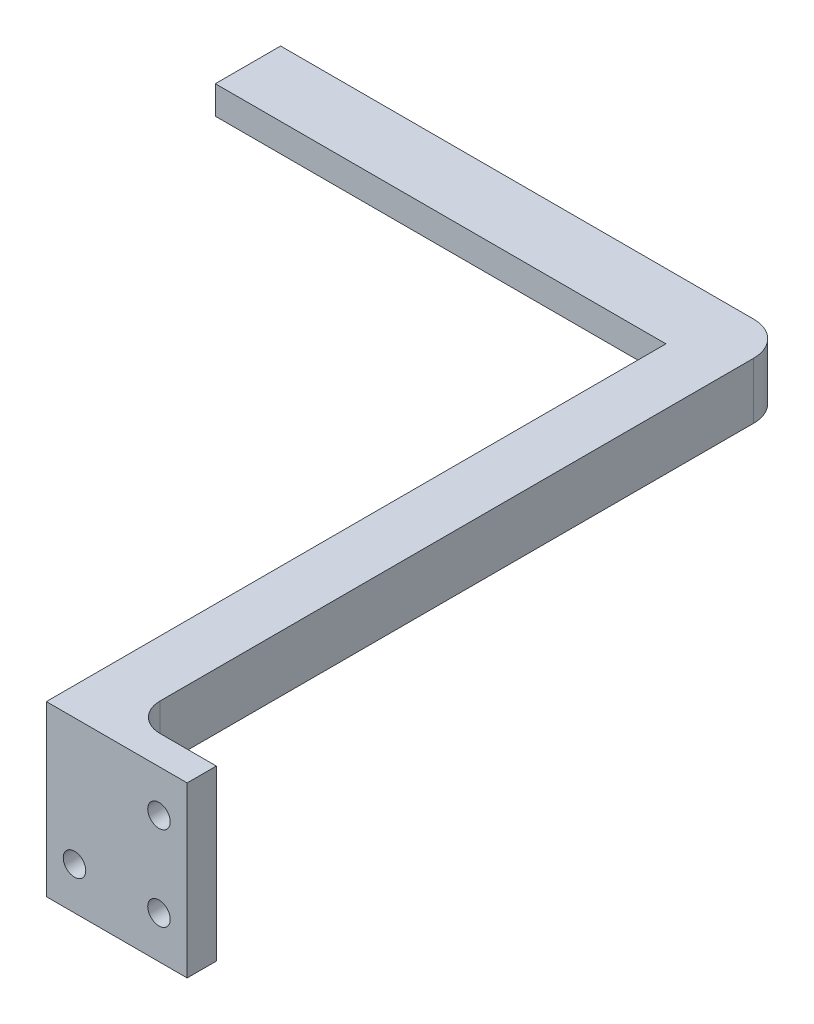
ISO-10303-21;
HEADER;
FILE_DESCRIPTION(('STEP AP214'),'2;1');
FILE_NAME('part.step','',(''),(''),'','','');
FILE_SCHEMA(('AUTOMOTIVE_DESIGN { 1 0 10303 214 1 1 1 1 }'));
ENDSEC;
DATA;
#1=APPLICATION_CONTEXT('core data for automotive mechanical design processes');
#2=APPLICATION_PROTOCOL_DEFINITION('international standard','automotive_design',2000,#1);
#3=PRODUCT_CONTEXT('',#1,'mechanical');
#4=PRODUCT('Part','Part','',(#3));
#5=PRODUCT_RELATED_PRODUCT_CATEGORY('part','',(#4));
#6=PRODUCT_DEFINITION_FORMATION('','',#4);
#7=PRODUCT_DEFINITION_CONTEXT('part definition',#1,'design');
#8=PRODUCT_DEFINITION('design','',#6,#7);
#9=PRODUCT_DEFINITION_SHAPE('','',#8);
#10=(LENGTH_UNIT() NAMED_UNIT(*) SI_UNIT(.MILLI.,.METRE.));
#11=(NAMED_UNIT(*) PLANE_ANGLE_UNIT() SI_UNIT($,.RADIAN.));
#12=(NAMED_UNIT(*) SI_UNIT($,.STERADIAN.) SOLID_ANGLE_UNIT());
#13=UNCERTAINTY_MEASURE_WITH_UNIT(LENGTH_MEASURE(1.E-05),#10,'distance_accuracy_value','');
#14=(GEOMETRIC_REPRESENTATION_CONTEXT(3) GLOBAL_UNCERTAINTY_ASSIGNED_CONTEXT((#13)) GLOBAL_UNIT_ASSIGNED_CONTEXT((#10,
#11,#12)) REPRESENTATION_CONTEXT('',''));
#15=CARTESIAN_POINT('',(0.,0.,0.));
#16=DIRECTION('',(0.,0.,1.));
#17=DIRECTION('',(1.,0.,0.));
#18=AXIS2_PLACEMENT_3D('',#15,#16,#17);
#19=CARTESIAN_POINT('',(15.,10.,0.));
#20=DIRECTION('',(-1.,0.,0.));
#21=DIRECTION('',(0.,0.,1.));
#22=AXIS2_PLACEMENT_3D('',#19,#20,#21);
#23=PLANE('',#22);
#24=DIRECTION('',(0.,-1.,0.));
#25=VECTOR('',#24,1.);
#26=CARTESIAN_POINT('',(15.,10.,-5.18268931834928));
#27=LINE('',#26,#25);
#28=CARTESIAN_POINT('',(15.,10.,-5.18268931834928));
#29=VERTEX_POINT('',#28);
#30=CARTESIAN_POINT('',(15.,-20.,-5.18268931834928));
#31=VERTEX_POINT('',#30);
#32=EDGE_CURVE('E143',#29,#31,#27,.T.);
#33=ORIENTED_EDGE('',*,*,#32,.F.);
#34=DIRECTION('',(0.,0.,-1.));
#35=VECTOR('',#34,1.);
#36=CARTESIAN_POINT('',(15.,10.,0.));
#37=LINE('',#36,#35);
#38=CARTESIAN_POINT('',(15.,10.,0.));
#39=VERTEX_POINT('',#38);
#40=EDGE_CURVE('E156',#39,#29,#37,.T.);
#41=ORIENTED_EDGE('',*,*,#40,.F.);
#42=DIRECTION('',(0.,-1.,0.));
#43=VECTOR('',#42,1.);
#44=CARTESIAN_POINT('',(15.,10.,0.));
#45=LINE('',#44,#43);
#46=CARTESIAN_POINT('',(15.,-20.,0.));
#47=VERTEX_POINT('',#46);
#48=EDGE_CURVE('E198',#39,#47,#45,.T.);
#49=ORIENTED_EDGE('',*,*,#48,.T.);
#50=DIRECTION('',(0.,0.,1.));
#51=VECTOR('',#50,1.);
#52=CARTESIAN_POINT('',(15.,-20.,0.));
#53=LINE('',#52,#51);
#54=EDGE_CURVE('E158',#31,#47,#53,.T.);
#55=ORIENTED_EDGE('',*,*,#54,.F.);
#56=EDGE_LOOP('',(#33,#41,#49,#55));
#57=FACE_BOUND('',#56,.T.);
#58=ADVANCED_FACE('F47',(#57),#23,.F.);
#59=CARTESIAN_POINT('',(0.,-20.,0.));
#60=DIRECTION('',(0.,1.,0.));
#61=DIRECTION('',(0.,0.,1.));
#62=AXIS2_PLACEMENT_3D('',#59,#60,#61);
#63=PLANE('',#62);
#64=DIRECTION('',(-1.,0.,0.));
#65=VECTOR('',#64,1.);
#66=CARTESIAN_POINT('',(15.,-20.,-5.18268931834928));
#67=LINE('',#66,#65);
#68=CARTESIAN_POINT('',(-9.99999999999999,-20.,-5.18268931834928));
#69=VERTEX_POINT('',#68);
#70=EDGE_CURVE('E160',#31,#69,#67,.T.);
#71=ORIENTED_EDGE('',*,*,#70,.F.);
#72=ORIENTED_EDGE('',*,*,#54,.T.);
#73=DIRECTION('',(-1.,0.,0.));
#74=VECTOR('',#73,1.);
#75=CARTESIAN_POINT('',(15.,-20.,0.));
#76=LINE('',#75,#74);
#77=CARTESIAN_POINT('',(-9.99999999999999,-20.,0.));
#78=VERTEX_POINT('',#77);
#79=EDGE_CURVE('E290',#47,#78,#76,.T.);
#80=ORIENTED_EDGE('',*,*,#79,.T.);
#81=DIRECTION('',(0.,0.,-1.));
#82=VECTOR('',#81,1.);
#83=CARTESIAN_POINT('',(-9.99999999999999,-20.,0.));
#84=LINE('',#83,#82);
#85=EDGE_CURVE('E184',#78,#69,#84,.T.);
#86=ORIENTED_EDGE('',*,*,#85,.T.);
#87=EDGE_LOOP('',(#71,#72,#80,#86));
#88=FACE_BOUND('',#87,.T.);
#89=ADVANCED_FACE('F339',(#88),#63,.F.);
#90=CARTESIAN_POINT('',(-4.99999999999999,-12.5,12.8173106816507));
#91=DIRECTION('',(0.,0.,-1.));
#92=DIRECTION('',(-1.,0.,0.));
#93=AXIS2_PLACEMENT_3D('',#90,#91,#92);
#94=CYLINDRICAL_SURFACE('',#93,2.);
#95=CARTESIAN_POINT('',(-4.99999999999999,-12.5,0.));
#96=DIRECTION('',(0.,0.,1.));
#97=DIRECTION('',(1.,0.,0.));
#98=AXIS2_PLACEMENT_3D('',#95,#96,#97);
#99=CIRCLE('',#98,2.);
#100=CARTESIAN_POINT('',(-2.99999999999999,-12.5,0.));
#101=VERTEX_POINT('',#100);
#102=EDGE_CURVE('E305',#101,#101,#99,.T.);
#103=ORIENTED_EDGE('',*,*,#102,.T.);
#104=EDGE_LOOP('',(#103));
#105=FACE_BOUND('',#104,.T.);
#106=CARTESIAN_POINT('',(-4.99999999999999,-12.5,-5.18268931834928));
#107=DIRECTION('',(0.,0.,-1.));
#108=DIRECTION('',(-1.,0.,0.));
#109=AXIS2_PLACEMENT_3D('',#106,#107,#108);
#110=CIRCLE('',#109,2.);
#111=CARTESIAN_POINT('',(-6.99999999999999,-12.5,-5.18268931834928));
#112=VERTEX_POINT('',#111);
#113=EDGE_CURVE('E314',#112,#112,#110,.T.);
#114=ORIENTED_EDGE('',*,*,#113,.T.);
#115=EDGE_LOOP('',(#114));
#116=FACE_BOUND('',#115,.T.);
#117=ADVANCED_FACE('F336',(#105,#116),#94,.F.);
#118=CARTESIAN_POINT('',(10.,-12.5,12.8173106816507));
#119=DIRECTION('',(0.,0.,-1.));
#120=DIRECTION('',(-1.,0.,0.));
#121=AXIS2_PLACEMENT_3D('',#118,#119,#120);
#122=CYLINDRICAL_SURFACE('',#121,2.);
#123=CARTESIAN_POINT('',(10.,-12.5,0.));
#124=DIRECTION('',(0.,0.,1.));
#125=DIRECTION('',(1.,0.,0.));
#126=AXIS2_PLACEMENT_3D('',#123,#124,#125);
#127=CIRCLE('',#126,2.);
#128=CARTESIAN_POINT('',(12.,-12.5,0.));
#129=VERTEX_POINT('',#128);
#130=EDGE_CURVE('E301',#129,#129,#127,.F.);
#131=ORIENTED_EDGE('',*,*,#130,.F.);
#132=EDGE_LOOP('',(#131));
#133=FACE_BOUND('',#132,.T.);
#134=CARTESIAN_POINT('',(10.,-12.5,-5.18268931834928));
#135=DIRECTION('',(0.,0.,-1.));
#136=DIRECTION('',(-1.,0.,0.));
#137=AXIS2_PLACEMENT_3D('',#134,#135,#136);
#138=CIRCLE('',#137,2.);
#139=CARTESIAN_POINT('',(8.,-12.5,-5.18268931834928));
#140=VERTEX_POINT('',#139);
#141=EDGE_CURVE('E318',#140,#140,#138,.T.);
#142=ORIENTED_EDGE('',*,*,#141,.T.);
#143=EDGE_LOOP('',(#142));
#144=FACE_BOUND('',#143,.T.);
#145=ADVANCED_FACE('F338',(#133,#144),#122,.F.);
#146=CARTESIAN_POINT('',(10.,2.5,12.8173106816507));
#147=DIRECTION('',(0.,0.,-1.));
#148=DIRECTION('',(-1.,0.,0.));
#149=AXIS2_PLACEMENT_3D('',#146,#147,#148);
#150=CYLINDRICAL_SURFACE('',#149,2.);
#151=CARTESIAN_POINT('',(10.,2.5,0.));
#152=DIRECTION('',(0.,0.,1.));
#153=DIRECTION('',(1.,0.,0.));
#154=AXIS2_PLACEMENT_3D('',#151,#152,#153);
#155=CIRCLE('',#154,2.);
#156=CARTESIAN_POINT('',(12.,2.5,0.));
#157=VERTEX_POINT('',#156);
#158=EDGE_CURVE('E295',#157,#157,#155,.T.);
#159=ORIENTED_EDGE('',*,*,#158,.T.);
#160=EDGE_LOOP('',(#159));
#161=FACE_BOUND('',#160,.T.);
#162=CARTESIAN_POINT('',(10.,2.5,-5.18268931834928));
#163=DIRECTION('',(0.,0.,-1.));
#164=DIRECTION('',(-1.,0.,0.));
#165=AXIS2_PLACEMENT_3D('',#162,#163,#164);
#166=CIRCLE('',#165,2.);
#167=CARTESIAN_POINT('',(8.,2.5,-5.18268931834928));
#168=VERTEX_POINT('',#167);
#169=EDGE_CURVE('E234',#168,#168,#166,.T.);
#170=ORIENTED_EDGE('',*,*,#169,.T.);
#171=EDGE_LOOP('',(#170));
#172=FACE_BOUND('',#171,.T.);
#173=ADVANCED_FACE('F326',(#161,#172),#150,.F.);
#174=CARTESIAN_POINT('',(0.,10.,0.));
#175=DIRECTION('',(0.,0.,1.));
#176=DIRECTION('',(1.,0.,0.));
#177=AXIS2_PLACEMENT_3D('',#174,#175,#176);
#178=PLANE('',#177);
#179=ORIENTED_EDGE('',*,*,#158,.F.);
#180=EDGE_LOOP('',(#179));
#181=FACE_BOUND('',#180,.T.);
#182=DIRECTION('',(0.,-1.,0.));
#183=VECTOR('',#182,1.);
#184=CARTESIAN_POINT('',(-9.99999999999999,10.,0.));
#185=LINE('',#184,#183);
#186=CARTESIAN_POINT('',(-9.99999999999999,10.,0.));
#187=VERTEX_POINT('',#186);
#188=EDGE_CURVE('E201',#187,#78,#185,.T.);
#189=ORIENTED_EDGE('',*,*,#188,.T.);
#190=ORIENTED_EDGE('',*,*,#79,.F.);
#191=ORIENTED_EDGE('',*,*,#48,.F.);
#192=DIRECTION('',(-1.,0.,0.));
#193=VECTOR('',#192,1.);
#194=CARTESIAN_POINT('',(0.,10.,0.));
#195=LINE('',#194,#193);
#196=EDGE_CURVE('E164',#39,#187,#195,.T.);
#197=ORIENTED_EDGE('',*,*,#196,.T.);
#198=EDGE_LOOP('',(#189,#190,#191,#197));
#199=FACE_BOUND('',#198,.T.);
#200=ORIENTED_EDGE('',*,*,#102,.F.);
#201=EDGE_LOOP('',(#200));
#202=FACE_BOUND('',#201,.T.);
#203=ORIENTED_EDGE('',*,*,#130,.T.);
#204=EDGE_LOOP('',(#203));
#205=FACE_BOUND('',#204,.T.);
#206=ADVANCED_FACE('F288',(#181,#199,#202,#205),#178,.T.);
#207=CARTESIAN_POINT('',(0.,0.,0.));
#208=DIRECTION('',(0.,1.,0.));
#209=DIRECTION('',(0.,0.,1.));
#210=AXIS2_PLACEMENT_3D('',#207,#208,#209);
#211=PLANE('',#210);
#212=DIRECTION('',(-1.,0.,0.));
#213=VECTOR('',#212,1.);
#214=CARTESIAN_POINT('',(0.,0.,-121.590602054854));
#215=LINE('',#214,#213);
#216=CARTESIAN_POINT('',(-6.,0.,-121.590602054854));
#217=VERTEX_POINT('',#216);
#218=CARTESIAN_POINT('',(-90.,0.,-121.590602054854));
#219=VERTEX_POINT('',#218);
#220=EDGE_CURVE('E191',#217,#219,#215,.T.);
#221=ORIENTED_EDGE('',*,*,#220,.F.);
#222=CARTESIAN_POINT('',(-6.,0.,-115.590602054854));
#223=DIRECTION('',(0.,1.,0.));
#224=DIRECTION('',(0.,0.,1.));
#225=AXIS2_PLACEMENT_3D('',#222,#223,#224);
#226=CIRCLE('',#225,6.);
#227=CARTESIAN_POINT('',(0.,0.,-115.590602054854));
#228=VERTEX_POINT('',#227);
#229=EDGE_CURVE('E70',#217,#228,#226,.F.);
#230=ORIENTED_EDGE('',*,*,#229,.T.);
#231=DIRECTION('',(0.,0.,-1.));
#232=VECTOR('',#231,1.);
#233=CARTESIAN_POINT('',(0.,0.,0.));
#234=LINE('',#233,#232);
#235=CARTESIAN_POINT('',(0.,0.,-10.1826893183493));
#236=VERTEX_POINT('',#235);
#237=EDGE_CURVE('E188',#236,#228,#234,.T.);
#238=ORIENTED_EDGE('',*,*,#237,.F.);
#239=DIRECTION('',(1.,0.,0.));
#240=VECTOR('',#239,1.);
#241=CARTESIAN_POINT('',(0.,0.,-10.1826893183493));
#242=LINE('',#241,#240);
#243=CARTESIAN_POINT('',(-9.99999999999999,0.,-10.1826893183493));
#244=VERTEX_POINT('',#243);
#245=EDGE_CURVE('E220',#236,#244,#242,.F.);
#246=ORIENTED_EDGE('',*,*,#245,.T.);
#247=DIRECTION('',(0.,0.,1.));
#248=VECTOR('',#247,1.);
#249=CARTESIAN_POINT('',(-9.99999999999999,0.,0.));
#250=LINE('',#249,#248);
#251=CARTESIAN_POINT('',(-10.,0.,-115.));
#252=VERTEX_POINT('',#251);
#253=EDGE_CURVE('E183',#252,#244,#250,.T.);
#254=ORIENTED_EDGE('',*,*,#253,.F.);
#255=DIRECTION('',(-1.,0.,0.));
#256=VECTOR('',#255,1.);
#257=CARTESIAN_POINT('',(-90.,0.,-115.));
#258=LINE('',#257,#256);
#259=CARTESIAN_POINT('',(-90.,0.,-115.));
#260=VERTEX_POINT('',#259);
#261=EDGE_CURVE('E229',#252,#260,#258,.T.);
#262=ORIENTED_EDGE('',*,*,#261,.T.);
#263=DIRECTION('',(0.,0.,-1.));
#264=VECTOR('',#263,1.);
#265=CARTESIAN_POINT('',(-90.,0.,0.));
#266=LINE('',#265,#264);
#267=EDGE_CURVE('E179',#260,#219,#266,.T.);
#268=ORIENTED_EDGE('',*,*,#267,.T.);
#269=EDGE_LOOP('',(#221,#230,#238,#246,#254,#262,#268));
#270=FACE_BOUND('',#269,.T.);
#271=ADVANCED_FACE('F261',(#270),#211,.F.);
#272=CARTESIAN_POINT('',(-90.,10.,0.));
#273=DIRECTION('',(-1.,0.,0.));
#274=DIRECTION('',(0.,0.,1.));
#275=AXIS2_PLACEMENT_3D('',#272,#273,#274);
#276=PLANE('',#275);
#277=ORIENTED_EDGE('',*,*,#267,.F.);
#278=DIRECTION('',(0.,0.707106781186549,0.707106781186547));
#279=VECTOR('',#278,1.);
#280=CARTESIAN_POINT('',(-90.,62.5,-52.5000000000002));
#281=LINE('',#280,#279);
#282=CARTESIAN_POINT('',(-90.,5.00000000000003,-110.));
#283=VERTEX_POINT('',#282);
#284=EDGE_CURVE('E238',#260,#283,#281,.T.);
#285=ORIENTED_EDGE('',*,*,#284,.T.);
#286=DIRECTION('',(0.,-1.,0.));
#287=VECTOR('',#286,1.);
#288=CARTESIAN_POINT('',(-90.,10.,-110.));
#289=LINE('',#288,#287);
#290=CARTESIAN_POINT('',(-90.,10.,-110.));
#291=VERTEX_POINT('',#290);
#292=EDGE_CURVE('E208',#291,#283,#289,.T.);
#293=ORIENTED_EDGE('',*,*,#292,.F.);
#294=DIRECTION('',(0.,0.,-1.));
#295=VECTOR('',#294,1.);
#296=CARTESIAN_POINT('',(-90.,10.,0.));
#297=LINE('',#296,#295);
#298=CARTESIAN_POINT('',(-90.,10.,-121.590602054854));
#299=VERTEX_POINT('',#298);
#300=EDGE_CURVE('E194',#291,#299,#297,.T.);
#301=ORIENTED_EDGE('',*,*,#300,.T.);
#302=DIRECTION('',(0.,-1.,0.));
#303=VECTOR('',#302,1.);
#304=CARTESIAN_POINT('',(-90.,10.,-121.590602054854));
#305=LINE('',#304,#303);
#306=EDGE_CURVE('E178',#299,#219,#305,.T.);
#307=ORIENTED_EDGE('',*,*,#306,.T.);
#308=EDGE_LOOP('',(#277,#285,#293,#301,#307));
#309=FACE_BOUND('',#308,.T.);
#310=ADVANCED_FACE('F266',(#309),#276,.T.);
#311=CARTESIAN_POINT('',(0.,10.,-110.));
#312=DIRECTION('',(0.,0.,1.));
#313=DIRECTION('',(1.,0.,0.));
#314=AXIS2_PLACEMENT_3D('',#311,#312,#313);
#315=PLANE('',#314);
#316=ORIENTED_EDGE('',*,*,#292,.T.);
#317=DIRECTION('',(1.,0.,0.));
#318=VECTOR('',#317,1.);
#319=CARTESIAN_POINT('',(-10.,5.00000000000003,-110.));
#320=LINE('',#319,#318);
#321=CARTESIAN_POINT('',(-10.,5.00000000000003,-110.));
#322=VERTEX_POINT('',#321);
#323=EDGE_CURVE('E241',#283,#322,#320,.T.);
#324=ORIENTED_EDGE('',*,*,#323,.T.);
#325=DIRECTION('',(0.,-1.,0.));
#326=VECTOR('',#325,1.);
#327=CARTESIAN_POINT('',(-10.,10.,-110.));
#328=LINE('',#327,#326);
#329=CARTESIAN_POINT('',(-10.,10.,-110.));
#330=VERTEX_POINT('',#329);
#331=EDGE_CURVE('E204',#330,#322,#328,.T.);
#332=ORIENTED_EDGE('',*,*,#331,.F.);
#333=DIRECTION('',(-1.,0.,0.));
#334=VECTOR('',#333,1.);
#335=CARTESIAN_POINT('',(0.,10.,-110.));
#336=LINE('',#335,#334);
#337=EDGE_CURVE('E271',#330,#291,#336,.T.);
#338=ORIENTED_EDGE('',*,*,#337,.T.);
#339=EDGE_LOOP('',(#316,#324,#332,#338));
#340=FACE_BOUND('',#339,.T.);
#341=ADVANCED_FACE('F362',(#340),#315,.T.);
#342=CARTESIAN_POINT('',(-9.99999999999999,10.,0.));
#343=DIRECTION('',(1.,0.,0.));
#344=DIRECTION('',(0.,0.,-1.));
#345=AXIS2_PLACEMENT_3D('',#342,#343,#344);
#346=PLANE('',#345);
#347=ORIENTED_EDGE('',*,*,#253,.T.);
#348=CARTESIAN_POINT('',(-9.99999999999999,-5.,-10.1826893183493));
#349=DIRECTION('',(1.,0.,0.));
#350=DIRECTION('',(0.,0.,-1.));
#351=AXIS2_PLACEMENT_3D('',#348,#349,#350);
#352=CIRCLE('',#351,5.);
#353=CARTESIAN_POINT('',(-9.99999999999999,-5.,-5.18268931834928));
#354=VERTEX_POINT('',#353);
#355=EDGE_CURVE('E226',#244,#354,#352,.T.);
#356=ORIENTED_EDGE('',*,*,#355,.T.);
#357=DIRECTION('',(0.,1.,0.));
#358=VECTOR('',#357,1.);
#359=CARTESIAN_POINT('',(-9.99999999999999,-20.,-5.18268931834928));
#360=LINE('',#359,#358);
#361=EDGE_CURVE('E150',#69,#354,#360,.T.);
#362=ORIENTED_EDGE('',*,*,#361,.F.);
#363=ORIENTED_EDGE('',*,*,#85,.F.);
#364=ORIENTED_EDGE('',*,*,#188,.F.);
#365=DIRECTION('',(0.,0.,1.));
#366=VECTOR('',#365,1.);
#367=CARTESIAN_POINT('',(-9.99999999999999,10.,0.));
#368=LINE('',#367,#366);
#369=EDGE_CURVE('E172',#330,#187,#368,.T.);
#370=ORIENTED_EDGE('',*,*,#369,.F.);
#371=ORIENTED_EDGE('',*,*,#331,.T.);
#372=DIRECTION('',(0.,-0.707106781186549,-0.707106781186547));
#373=VECTOR('',#372,1.);
#374=CARTESIAN_POINT('',(-9.99999999999999,62.5,-52.5000000000002));
#375=LINE('',#374,#373);
#376=EDGE_CURVE('E244',#322,#252,#375,.T.);
#377=ORIENTED_EDGE('',*,*,#376,.T.);
#378=EDGE_LOOP('',(#347,#356,#362,#363,#364,#370,#371,#377));
#379=FACE_BOUND('',#378,.T.);
#380=ADVANCED_FACE('F282',(#379),#346,.F.);
#381=CARTESIAN_POINT('',(0.,10.,0.));
#382=DIRECTION('',(-1.,0.,0.));
#383=DIRECTION('',(0.,0.,1.));
#384=AXIS2_PLACEMENT_3D('',#381,#382,#383);
#385=PLANE('',#384);
#386=ORIENTED_EDGE('',*,*,#237,.T.);
#387=DIRECTION('',(0.,-1.,0.));
#388=VECTOR('',#387,1.);
#389=CARTESIAN_POINT('',(0.,10.,-115.590602054854));
#390=LINE('',#389,#388);
#391=CARTESIAN_POINT('',(0.,10.,-115.590602054854));
#392=VERTEX_POINT('',#391);
#393=EDGE_CURVE('E56',#228,#392,#390,.F.);
#394=ORIENTED_EDGE('',*,*,#393,.T.);
#395=DIRECTION('',(0.,0.,-1.));
#396=VECTOR('',#395,1.);
#397=CARTESIAN_POINT('',(0.,10.,0.));
#398=LINE('',#397,#396);
#399=CARTESIAN_POINT('',(0.,10.,-10.1826893183493));
#400=VERTEX_POINT('',#399);
#401=EDGE_CURVE('E166',#400,#392,#398,.T.);
#402=ORIENTED_EDGE('',*,*,#401,.F.);
#403=DIRECTION('',(0.,1.,0.));
#404=VECTOR('',#403,1.);
#405=CARTESIAN_POINT('',(0.,10.,-10.1826893183493));
#406=LINE('',#405,#404);
#407=EDGE_CURVE('E217',#400,#236,#406,.F.);
#408=ORIENTED_EDGE('',*,*,#407,.T.);
#409=EDGE_LOOP('',(#386,#394,#402,#408));
#410=FACE_BOUND('',#409,.T.);
#411=ADVANCED_FACE('F355',(#410),#385,.F.);
#412=CARTESIAN_POINT('',(0.,10.,-121.590602054854));
#413=DIRECTION('',(0.,0.,1.));
#414=DIRECTION('',(1.,0.,0.));
#415=AXIS2_PLACEMENT_3D('',#412,#413,#414);
#416=PLANE('',#415);
#417=DIRECTION('',(-1.,0.,0.));
#418=VECTOR('',#417,1.);
#419=CARTESIAN_POINT('',(0.,10.,-121.590602054854));
#420=LINE('',#419,#418);
#421=CARTESIAN_POINT('',(-6.,10.,-121.590602054854));
#422=VERTEX_POINT('',#421);
#423=EDGE_CURVE('E170',#422,#299,#420,.T.);
#424=ORIENTED_EDGE('',*,*,#423,.F.);
#425=DIRECTION('',(0.,-1.,0.));
#426=VECTOR('',#425,1.);
#427=CARTESIAN_POINT('',(-6.,10.,-121.590602054854));
#428=LINE('',#427,#426);
#429=EDGE_CURVE('E248',#422,#217,#428,.T.);
#430=ORIENTED_EDGE('',*,*,#429,.T.);
#431=ORIENTED_EDGE('',*,*,#220,.T.);
#432=ORIENTED_EDGE('',*,*,#306,.F.);
#433=EDGE_LOOP('',(#424,#430,#431,#432));
#434=FACE_BOUND('',#433,.T.);
#435=ADVANCED_FACE('F257',(#434),#416,.F.);
#436=CARTESIAN_POINT('',(0.,10.,0.));
#437=DIRECTION('',(0.,1.,0.));
#438=DIRECTION('',(0.,0.,1.));
#439=AXIS2_PLACEMENT_3D('',#436,#437,#438);
#440=PLANE('',#439);
#441=ORIENTED_EDGE('',*,*,#401,.T.);
#442=CARTESIAN_POINT('',(-6.,10.,-115.590602054854));
#443=DIRECTION('',(0.,1.,0.));
#444=DIRECTION('',(0.,0.,1.));
#445=AXIS2_PLACEMENT_3D('',#442,#443,#444);
#446=CIRCLE('',#445,6.);
#447=EDGE_CURVE('E11',#392,#422,#446,.T.);
#448=ORIENTED_EDGE('',*,*,#447,.T.);
#449=ORIENTED_EDGE('',*,*,#423,.T.);
#450=ORIENTED_EDGE('',*,*,#300,.F.);
#451=ORIENTED_EDGE('',*,*,#337,.F.);
#452=ORIENTED_EDGE('',*,*,#369,.T.);
#453=ORIENTED_EDGE('',*,*,#196,.F.);
#454=ORIENTED_EDGE('',*,*,#40,.T.);
#455=DIRECTION('',(1.,0.,0.));
#456=VECTOR('',#455,1.);
#457=CARTESIAN_POINT('',(0.,10.,-5.18268931834928));
#458=LINE('',#457,#456);
#459=CARTESIAN_POINT('',(5.,10.,-5.18268931834928));
#460=VERTEX_POINT('',#459);
#461=EDGE_CURVE('E140',#460,#29,#458,.T.);
#462=ORIENTED_EDGE('',*,*,#461,.F.);
#463=CARTESIAN_POINT('',(5.,10.,-10.1826893183493));
#464=DIRECTION('',(0.,1.,0.));
#465=DIRECTION('',(0.,0.,1.));
#466=AXIS2_PLACEMENT_3D('',#463,#464,#465);
#467=CIRCLE('',#466,5.);
#468=EDGE_CURVE('E223',#460,#400,#467,.F.);
#469=ORIENTED_EDGE('',*,*,#468,.T.);
#470=EDGE_LOOP('',(#441,#448,#449,#450,#451,#452,#453,#454,#462,#469));
#471=FACE_BOUND('',#470,.T.);
#472=ADVANCED_FACE('F162',(#471),#440,.T.);
#473=CARTESIAN_POINT('',(0.,0.,-5.18268931834928));
#474=DIRECTION('',(0.,0.,-1.));
#475=DIRECTION('',(-1.,0.,0.));
#476=AXIS2_PLACEMENT_3D('',#473,#474,#475);
#477=PLANE('',#476);
#478=ORIENTED_EDGE('',*,*,#169,.F.);
#479=EDGE_LOOP('',(#478));
#480=FACE_BOUND('',#479,.T.);
#481=ORIENTED_EDGE('',*,*,#141,.F.);
#482=EDGE_LOOP('',(#481));
#483=FACE_BOUND('',#482,.T.);
#484=ORIENTED_EDGE('',*,*,#113,.F.);
#485=EDGE_LOOP('',(#484));
#486=FACE_BOUND('',#485,.T.);
#487=DIRECTION('',(1.,0.,0.));
#488=VECTOR('',#487,1.);
#489=CARTESIAN_POINT('',(0.,-5.,-5.18268931834928));
#490=LINE('',#489,#488);
#491=CARTESIAN_POINT('',(5.,-5.,-5.18268931834928));
#492=VERTEX_POINT('',#491);
#493=EDGE_CURVE('E212',#354,#492,#490,.T.);
#494=ORIENTED_EDGE('',*,*,#493,.T.);
#495=DIRECTION('',(0.,1.,0.));
#496=VECTOR('',#495,1.);
#497=CARTESIAN_POINT('',(5.,0.,-5.18268931834928));
#498=LINE('',#497,#496);
#499=EDGE_CURVE('E146',#492,#460,#498,.T.);
#500=ORIENTED_EDGE('',*,*,#499,.T.);
#501=ORIENTED_EDGE('',*,*,#461,.T.);
#502=ORIENTED_EDGE('',*,*,#32,.T.);
#503=ORIENTED_EDGE('',*,*,#70,.T.);
#504=ORIENTED_EDGE('',*,*,#361,.T.);
#505=EDGE_LOOP('',(#494,#500,#501,#502,#503,#504));
#506=FACE_BOUND('',#505,.T.);
#507=ADVANCED_FACE('F142',(#480,#483,#486,#506),#477,.T.);
#508=CARTESIAN_POINT('',(0.,-5.,-10.1826893183493));
#509=DIRECTION('',(1.,0.,0.));
#510=DIRECTION('',(0.,0.,-1.));
#511=AXIS2_PLACEMENT_3D('',#508,#509,#510);
#512=CYLINDRICAL_SURFACE('',#511,5.);
#513=ORIENTED_EDGE('',*,*,#355,.F.);
#514=ORIENTED_EDGE('',*,*,#245,.F.);
#515=CARTESIAN_POINT('',(5.,-5.,-10.1826893183493));
#516=DIRECTION('',(0.707106781186547,0.707106781186547,0.));
#517=DIRECTION('',(0.707106781186547,-0.707106781186547,0.));
#518=AXIS2_PLACEMENT_3D('',#515,#516,#517);
#519=ELLIPSE('',#518,7.07106781186547,5.);
#520=EDGE_CURVE('E230',#492,#236,#519,.F.);
#521=ORIENTED_EDGE('',*,*,#520,.F.);
#522=ORIENTED_EDGE('',*,*,#493,.F.);
#523=EDGE_LOOP('',(#513,#514,#521,#522));
#524=FACE_BOUND('',#523,.T.);
#525=ADVANCED_FACE('F330',(#524),#512,.F.);
#526=CARTESIAN_POINT('',(5.,0.,-10.1826893183493));
#527=DIRECTION('',(0.,1.,0.));
#528=DIRECTION('',(0.,0.,1.));
#529=AXIS2_PLACEMENT_3D('',#526,#527,#528);
#530=CYLINDRICAL_SURFACE('',#529,5.);
#531=ORIENTED_EDGE('',*,*,#520,.T.);
#532=ORIENTED_EDGE('',*,*,#407,.F.);
#533=ORIENTED_EDGE('',*,*,#468,.F.);
#534=ORIENTED_EDGE('',*,*,#499,.F.);
#535=EDGE_LOOP('',(#531,#532,#533,#534));
#536=FACE_BOUND('',#535,.T.);
#537=ADVANCED_FACE('F368',(#536),#530,.F.);
#538=CARTESIAN_POINT('',(0.,0.,-115.));
#539=DIRECTION('',(0.,-0.707106781186546,0.707106781186548));
#540=DIRECTION('',(1.,0.,0.));
#541=AXIS2_PLACEMENT_3D('',#538,#539,#540);
#542=PLANE('',#541);
#543=ORIENTED_EDGE('',*,*,#376,.F.);
#544=ORIENTED_EDGE('',*,*,#323,.F.);
#545=ORIENTED_EDGE('',*,*,#284,.F.);
#546=ORIENTED_EDGE('',*,*,#261,.F.);
#547=EDGE_LOOP('',(#543,#544,#545,#546));
#548=FACE_BOUND('',#547,.T.);
#549=ADVANCED_FACE('F371',(#548),#542,.T.);
#550=CARTESIAN_POINT('',(-6.,10.,-115.590602054854));
#551=DIRECTION('',(0.,-1.,0.));
#552=DIRECTION('',(0.,0.,-1.));
#553=AXIS2_PLACEMENT_3D('',#550,#551,#552);
#554=CYLINDRICAL_SURFACE('',#553,6.);
#555=ORIENTED_EDGE('',*,*,#447,.F.);
#556=ORIENTED_EDGE('',*,*,#393,.F.);
#557=ORIENTED_EDGE('',*,*,#229,.F.);
#558=ORIENTED_EDGE('',*,*,#429,.F.);
#559=EDGE_LOOP('',(#555,#556,#557,#558));
#560=FACE_BOUND('',#559,.T.);
#561=ADVANCED_FACE('F49',(#560),#554,.T.);
#562=CLOSED_SHELL('',(#58,#89,#117,#145,#173,#206,#271,#310,#341,#380,#411,#435,#472,#507,#525,
#537,#549,#561));
#563=MANIFOLD_SOLID_BREP('B2',#562);
#564=ADVANCED_BREP_SHAPE_REPRESENTATION('',(#18,#563),#14);
#565=SHAPE_DEFINITION_REPRESENTATION(#9,#564);
ENDSEC;
END-ISO-10303-21;
